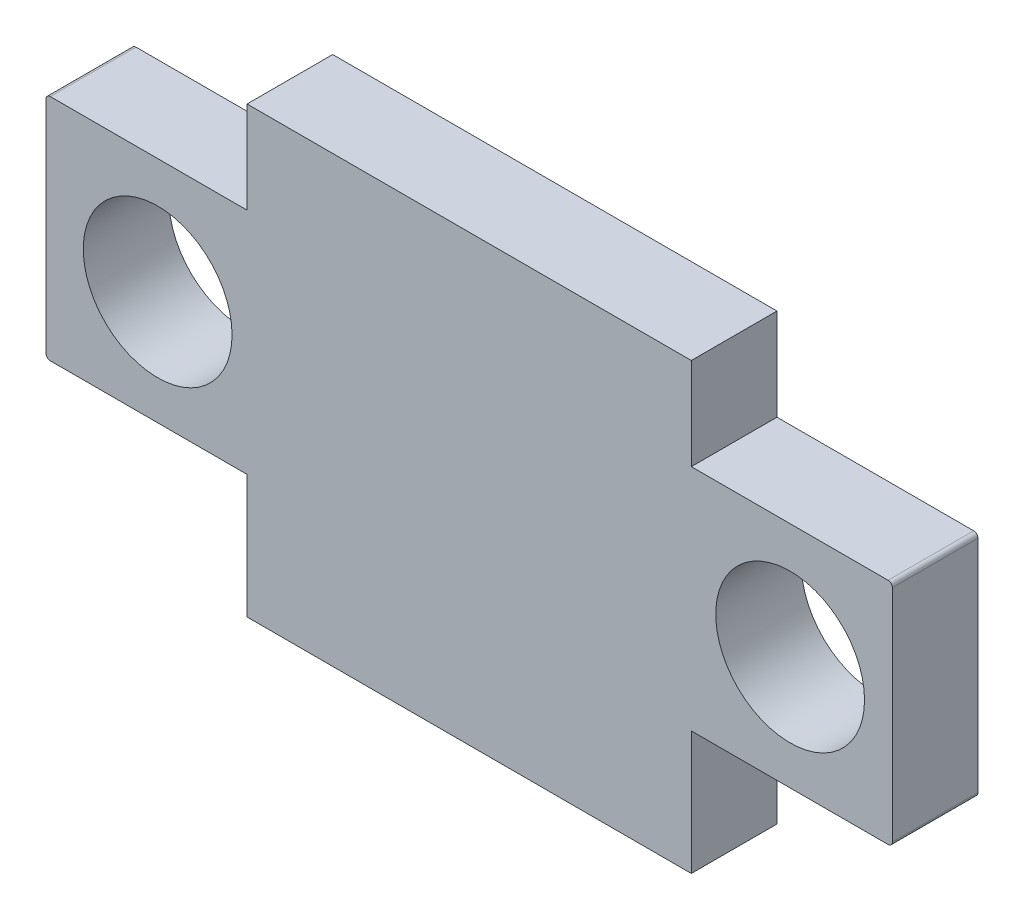
ISO-10303-21;
HEADER;
FILE_DESCRIPTION(('STEP AP214'),'2;1');
FILE_NAME('part.step','',(''),(''),'','','');
FILE_SCHEMA(('AUTOMOTIVE_DESIGN { 1 0 10303 214 1 1 1 1 }'));
ENDSEC;
DATA;
#1=APPLICATION_CONTEXT('core data for automotive mechanical design processes');
#2=APPLICATION_PROTOCOL_DEFINITION('international standard','automotive_design',2000,#1);
#3=PRODUCT_CONTEXT('',#1,'mechanical');
#4=PRODUCT('Part','Part','',(#3));
#5=PRODUCT_RELATED_PRODUCT_CATEGORY('part','',(#4));
#6=PRODUCT_DEFINITION_FORMATION('','',#4);
#7=PRODUCT_DEFINITION_CONTEXT('part definition',#1,'design');
#8=PRODUCT_DEFINITION('design','',#6,#7);
#9=PRODUCT_DEFINITION_SHAPE('','',#8);
#10=(LENGTH_UNIT() NAMED_UNIT(*) SI_UNIT(.MILLI.,.METRE.));
#11=(NAMED_UNIT(*) PLANE_ANGLE_UNIT() SI_UNIT($,.RADIAN.));
#12=(NAMED_UNIT(*) SI_UNIT($,.STERADIAN.) SOLID_ANGLE_UNIT());
#13=UNCERTAINTY_MEASURE_WITH_UNIT(LENGTH_MEASURE(1.E-05),#10,'distance_accuracy_value','');
#14=(GEOMETRIC_REPRESENTATION_CONTEXT(3) GLOBAL_UNCERTAINTY_ASSIGNED_CONTEXT((#13)) GLOBAL_UNIT_ASSIGNED_CONTEXT((#10,
#11,#12)) REPRESENTATION_CONTEXT('',''));
#15=CARTESIAN_POINT('',(0.,0.,0.));
#16=DIRECTION('',(0.,0.,1.));
#17=DIRECTION('',(1.,0.,0.));
#18=AXIS2_PLACEMENT_3D('',#15,#16,#17);
#19=CARTESIAN_POINT('',(0.,6.08054906162739,4.));
#20=DIRECTION('',(0.,-1.,0.));
#21=DIRECTION('',(0.,0.,-1.));
#22=AXIS2_PLACEMENT_3D('',#19,#20,#21);
#23=PLANE('',#22);
#24=DIRECTION('',(-1.,0.,0.));
#25=VECTOR('',#24,1.);
#26=CARTESIAN_POINT('',(0.,6.08054906162739,0.));
#27=LINE('',#26,#25);
#28=CARTESIAN_POINT('',(-10.375,6.08054906162739,0.));
#29=VERTEX_POINT('',#28);
#30=CARTESIAN_POINT('',(-19.5641972833082,6.08054906162739,0.));
#31=VERTEX_POINT('',#30);
#32=EDGE_CURVE('E205',#29,#31,#27,.T.);
#33=ORIENTED_EDGE('',*,*,#32,.T.);
#34=DIRECTION('',(0.,0.,-1.));
#35=VECTOR('',#34,1.);
#36=CARTESIAN_POINT('',(-19.5641972833082,6.08054906162739,4.));
#37=LINE('',#36,#35);
#38=CARTESIAN_POINT('',(-19.5641972833082,6.08054906162739,4.));
#39=VERTEX_POINT('',#38);
#40=EDGE_CURVE('E11',#39,#31,#37,.T.);
#41=ORIENTED_EDGE('',*,*,#40,.F.);
#42=DIRECTION('',(-1.,0.,0.));
#43=VECTOR('',#42,1.);
#44=CARTESIAN_POINT('',(0.,6.08054906162739,4.));
#45=LINE('',#44,#43);
#46=CARTESIAN_POINT('',(-10.375,6.08054906162739,4.));
#47=VERTEX_POINT('',#46);
#48=EDGE_CURVE('E359',#47,#39,#45,.T.);
#49=ORIENTED_EDGE('',*,*,#48,.F.);
#50=DIRECTION('',(0.,0.,-1.));
#51=VECTOR('',#50,1.);
#52=CARTESIAN_POINT('',(-10.375,6.08054906162739,4.));
#53=LINE('',#52,#51);
#54=EDGE_CURVE('E61',#47,#29,#53,.T.);
#55=ORIENTED_EDGE('',*,*,#54,.T.);
#56=EDGE_LOOP('',(#33,#41,#49,#55));
#57=FACE_BOUND('',#56,.T.);
#58=ADVANCED_FACE('F43',(#57),#23,.F.);
#59=CARTESIAN_POINT('',(-19.5641972833082,5.88054906162739,4.));
#60=DIRECTION('',(0.,0.,-1.));
#61=DIRECTION('',(-1.,0.,0.));
#62=AXIS2_PLACEMENT_3D('',#59,#60,#61);
#63=CYLINDRICAL_SURFACE('',#62,0.2);
#64=CARTESIAN_POINT('',(-19.5641972833082,5.88054906162739,0.));
#65=DIRECTION('',(0.,0.,1.));
#66=DIRECTION('',(1.,0.,0.));
#67=AXIS2_PLACEMENT_3D('',#64,#65,#66);
#68=CIRCLE('',#67,0.2);
#69=CARTESIAN_POINT('',(-19.7641972833082,5.88054906162739,0.));
#70=VERTEX_POINT('',#69);
#71=EDGE_CURVE('E208',#31,#70,#68,.T.);
#72=ORIENTED_EDGE('',*,*,#71,.T.);
#73=DIRECTION('',(0.,0.,-1.));
#74=VECTOR('',#73,1.);
#75=CARTESIAN_POINT('',(-19.7641972833082,5.88054906162739,4.));
#76=LINE('',#75,#74);
#77=CARTESIAN_POINT('',(-19.7641972833082,5.88054906162739,4.));
#78=VERTEX_POINT('',#77);
#79=EDGE_CURVE('E53',#78,#70,#76,.T.);
#80=ORIENTED_EDGE('',*,*,#79,.F.);
#81=CARTESIAN_POINT('',(-19.5641972833082,5.88054906162739,4.));
#82=DIRECTION('',(0.,0.,1.));
#83=DIRECTION('',(1.,0.,0.));
#84=AXIS2_PLACEMENT_3D('',#81,#82,#83);
#85=CIRCLE('',#84,0.2);
#86=EDGE_CURVE('E123',#39,#78,#85,.T.);
#87=ORIENTED_EDGE('',*,*,#86,.F.);
#88=ORIENTED_EDGE('',*,*,#40,.T.);
#89=EDGE_LOOP('',(#72,#80,#87,#88));
#90=FACE_BOUND('',#89,.T.);
#91=ADVANCED_FACE('F364',(#90),#63,.T.);
#92=CARTESIAN_POINT('',(-19.7641972833082,0.,4.));
#93=DIRECTION('',(1.,0.,0.));
#94=DIRECTION('',(0.,0.,-1.));
#95=AXIS2_PLACEMENT_3D('',#92,#93,#94);
#96=PLANE('',#95);
#97=DIRECTION('',(0.,-1.,0.));
#98=VECTOR('',#97,1.);
#99=CARTESIAN_POINT('',(-19.7641972833082,0.,0.));
#100=LINE('',#99,#98);
#101=CARTESIAN_POINT('',(-19.7641972833082,-4.40841613091758,0.));
#102=VERTEX_POINT('',#101);
#103=EDGE_CURVE('E211',#70,#102,#100,.T.);
#104=ORIENTED_EDGE('',*,*,#103,.T.);
#105=DIRECTION('',(0.,0.,-1.));
#106=VECTOR('',#105,1.);
#107=CARTESIAN_POINT('',(-19.7641972833082,-4.40841613091758,4.));
#108=LINE('',#107,#106);
#109=CARTESIAN_POINT('',(-19.7641972833082,-4.40841613091758,4.));
#110=VERTEX_POINT('',#109);
#111=EDGE_CURVE('E296',#110,#102,#108,.T.);
#112=ORIENTED_EDGE('',*,*,#111,.F.);
#113=DIRECTION('',(0.,-1.,0.));
#114=VECTOR('',#113,1.);
#115=CARTESIAN_POINT('',(-19.7641972833082,0.,4.));
#116=LINE('',#115,#114);
#117=EDGE_CURVE('E306',#78,#110,#116,.T.);
#118=ORIENTED_EDGE('',*,*,#117,.F.);
#119=ORIENTED_EDGE('',*,*,#79,.T.);
#120=EDGE_LOOP('',(#104,#112,#118,#119));
#121=FACE_BOUND('',#120,.T.);
#122=ADVANCED_FACE('F304',(#121),#96,.F.);
#123=CARTESIAN_POINT('',(-19.5641972833082,-4.40841613091758,4.));
#124=DIRECTION('',(0.,0.,-1.));
#125=DIRECTION('',(-1.,0.,0.));
#126=AXIS2_PLACEMENT_3D('',#123,#124,#125);
#127=CYLINDRICAL_SURFACE('',#126,0.199999999999999);
#128=CARTESIAN_POINT('',(-19.5641972833082,-4.40841613091758,0.));
#129=DIRECTION('',(0.,0.,1.));
#130=DIRECTION('',(1.,0.,0.));
#131=AXIS2_PLACEMENT_3D('',#128,#129,#130);
#132=CIRCLE('',#131,0.199999999999999);
#133=CARTESIAN_POINT('',(-19.5641972833082,-4.60841613091758,0.));
#134=VERTEX_POINT('',#133);
#135=EDGE_CURVE('E214',#102,#134,#132,.T.);
#136=ORIENTED_EDGE('',*,*,#135,.T.);
#137=DIRECTION('',(0.,0.,-1.));
#138=VECTOR('',#137,1.);
#139=CARTESIAN_POINT('',(-19.5641972833082,-4.60841613091758,4.));
#140=LINE('',#139,#138);
#141=CARTESIAN_POINT('',(-19.5641972833082,-4.60841613091758,4.));
#142=VERTEX_POINT('',#141);
#143=EDGE_CURVE('E293',#142,#134,#140,.T.);
#144=ORIENTED_EDGE('',*,*,#143,.F.);
#145=CARTESIAN_POINT('',(-19.5641972833082,-4.40841613091758,4.));
#146=DIRECTION('',(0.,0.,1.));
#147=DIRECTION('',(1.,0.,0.));
#148=AXIS2_PLACEMENT_3D('',#145,#146,#147);
#149=CIRCLE('',#148,0.199999999999999);
#150=EDGE_CURVE('E317',#110,#142,#149,.T.);
#151=ORIENTED_EDGE('',*,*,#150,.F.);
#152=ORIENTED_EDGE('',*,*,#111,.T.);
#153=EDGE_LOOP('',(#136,#144,#151,#152));
#154=FACE_BOUND('',#153,.T.);
#155=ADVANCED_FACE('F314',(#154),#127,.T.);
#156=CARTESIAN_POINT('',(0.,-4.60841613091758,4.));
#157=DIRECTION('',(0.,-1.,0.));
#158=DIRECTION('',(1.,0.,0.));
#159=AXIS2_PLACEMENT_3D('',#156,#157,#158);
#160=PLANE('',#159);
#161=DIRECTION('',(-1.,0.,0.));
#162=VECTOR('',#161,1.);
#163=CARTESIAN_POINT('',(0.,-4.60841613091758,0.));
#164=LINE('',#163,#162);
#165=CARTESIAN_POINT('',(-10.375,-4.60841613091758,0.));
#166=VERTEX_POINT('',#165);
#167=EDGE_CURVE('E218',#166,#134,#164,.T.);
#168=ORIENTED_EDGE('',*,*,#167,.F.);
#169=DIRECTION('',(0.,0.,-1.));
#170=VECTOR('',#169,1.);
#171=CARTESIAN_POINT('',(-10.375,-4.60841613091758,4.));
#172=LINE('',#171,#170);
#173=CARTESIAN_POINT('',(-10.375,-4.60841613091758,4.));
#174=VERTEX_POINT('',#173);
#175=EDGE_CURVE('E290',#174,#166,#172,.T.);
#176=ORIENTED_EDGE('',*,*,#175,.F.);
#177=DIRECTION('',(-1.,0.,0.));
#178=VECTOR('',#177,1.);
#179=CARTESIAN_POINT('',(0.,-4.60841613091758,4.));
#180=LINE('',#179,#178);
#181=EDGE_CURVE('E320',#174,#142,#180,.T.);
#182=ORIENTED_EDGE('',*,*,#181,.T.);
#183=ORIENTED_EDGE('',*,*,#143,.T.);
#184=EDGE_LOOP('',(#168,#176,#182,#183));
#185=FACE_BOUND('',#184,.T.);
#186=ADVANCED_FACE('F375',(#185),#160,.T.);
#187=CARTESIAN_POINT('',(-10.375,0.,4.));
#188=DIRECTION('',(-1.,0.,0.));
#189=DIRECTION('',(0.,0.,1.));
#190=AXIS2_PLACEMENT_3D('',#187,#188,#189);
#191=PLANE('',#190);
#192=DIRECTION('',(0.,1.,0.));
#193=VECTOR('',#192,1.);
#194=CARTESIAN_POINT('',(-10.375,0.,0.));
#195=LINE('',#194,#193);
#196=CARTESIAN_POINT('',(-10.375,-10.375,0.));
#197=VERTEX_POINT('',#196);
#198=EDGE_CURVE('E222',#197,#166,#195,.T.);
#199=ORIENTED_EDGE('',*,*,#198,.F.);
#200=DIRECTION('',(0.,0.,-1.));
#201=VECTOR('',#200,1.);
#202=CARTESIAN_POINT('',(-10.375,-10.375,4.));
#203=LINE('',#202,#201);
#204=CARTESIAN_POINT('',(-10.375,-10.375,4.));
#205=VERTEX_POINT('',#204);
#206=EDGE_CURVE('E287',#205,#197,#203,.T.);
#207=ORIENTED_EDGE('',*,*,#206,.F.);
#208=DIRECTION('',(0.,1.,0.));
#209=VECTOR('',#208,1.);
#210=CARTESIAN_POINT('',(-10.375,0.,4.));
#211=LINE('',#210,#209);
#212=EDGE_CURVE('E194',#205,#174,#211,.T.);
#213=ORIENTED_EDGE('',*,*,#212,.T.);
#214=ORIENTED_EDGE('',*,*,#175,.T.);
#215=EDGE_LOOP('',(#199,#207,#213,#214));
#216=FACE_BOUND('',#215,.T.);
#217=ADVANCED_FACE('F378',(#216),#191,.T.);
#218=CARTESIAN_POINT('',(0.,-10.375,4.));
#219=DIRECTION('',(0.,1.,0.));
#220=DIRECTION('',(0.,0.,1.));
#221=AXIS2_PLACEMENT_3D('',#218,#219,#220);
#222=PLANE('',#221);
#223=DIRECTION('',(1.,0.,0.));
#224=VECTOR('',#223,1.);
#225=CARTESIAN_POINT('',(0.,-10.375,0.));
#226=LINE('',#225,#224);
#227=CARTESIAN_POINT('',(10.375,-10.375,0.));
#228=VERTEX_POINT('',#227);
#229=EDGE_CURVE('E226',#197,#228,#226,.T.);
#230=ORIENTED_EDGE('',*,*,#229,.T.);
#231=DIRECTION('',(0.,0.,-1.));
#232=VECTOR('',#231,1.);
#233=CARTESIAN_POINT('',(10.375,-10.375,4.));
#234=LINE('',#233,#232);
#235=CARTESIAN_POINT('',(10.375,-10.375,4.));
#236=VERTEX_POINT('',#235);
#237=EDGE_CURVE('E283',#236,#228,#234,.T.);
#238=ORIENTED_EDGE('',*,*,#237,.F.);
#239=DIRECTION('',(1.,0.,0.));
#240=VECTOR('',#239,1.);
#241=CARTESIAN_POINT('',(0.,-10.375,4.));
#242=LINE('',#241,#240);
#243=EDGE_CURVE('E330',#205,#236,#242,.T.);
#244=ORIENTED_EDGE('',*,*,#243,.F.);
#245=ORIENTED_EDGE('',*,*,#206,.T.);
#246=EDGE_LOOP('',(#230,#238,#244,#245));
#247=FACE_BOUND('',#246,.T.);
#248=ADVANCED_FACE('F380',(#247),#222,.F.);
#249=CARTESIAN_POINT('',(10.375,0.,4.));
#250=DIRECTION('',(-1.,0.,0.));
#251=DIRECTION('',(0.,0.,1.));
#252=AXIS2_PLACEMENT_3D('',#249,#250,#251);
#253=PLANE('',#252);
#254=DIRECTION('',(0.,1.,0.));
#255=VECTOR('',#254,1.);
#256=CARTESIAN_POINT('',(10.375,0.,0.));
#257=LINE('',#256,#255);
#258=CARTESIAN_POINT('',(10.375,-4.60841613091758,0.));
#259=VERTEX_POINT('',#258);
#260=EDGE_CURVE('E230',#228,#259,#257,.T.);
#261=ORIENTED_EDGE('',*,*,#260,.T.);
#262=DIRECTION('',(0.,0.,-1.));
#263=VECTOR('',#262,1.);
#264=CARTESIAN_POINT('',(10.375,-4.60841613091758,4.));
#265=LINE('',#264,#263);
#266=CARTESIAN_POINT('',(10.375,-4.60841613091758,4.));
#267=VERTEX_POINT('',#266);
#268=EDGE_CURVE('E279',#267,#259,#265,.T.);
#269=ORIENTED_EDGE('',*,*,#268,.F.);
#270=DIRECTION('',(0.,1.,0.));
#271=VECTOR('',#270,1.);
#272=CARTESIAN_POINT('',(10.375,0.,4.));
#273=LINE('',#272,#271);
#274=EDGE_CURVE('E176',#236,#267,#273,.T.);
#275=ORIENTED_EDGE('',*,*,#274,.F.);
#276=ORIENTED_EDGE('',*,*,#237,.T.);
#277=EDGE_LOOP('',(#261,#269,#275,#276));
#278=FACE_BOUND('',#277,.T.);
#279=ADVANCED_FACE('F383',(#278),#253,.F.);
#280=CARTESIAN_POINT('',(0.,-4.60841613091758,4.));
#281=DIRECTION('',(0.,1.,0.));
#282=DIRECTION('',(-1.,0.,0.));
#283=AXIS2_PLACEMENT_3D('',#280,#281,#282);
#284=PLANE('',#283);
#285=DIRECTION('',(1.,0.,0.));
#286=VECTOR('',#285,1.);
#287=CARTESIAN_POINT('',(0.,-4.60841613091758,0.));
#288=LINE('',#287,#286);
#289=CARTESIAN_POINT('',(19.5641972833082,-4.60841613091758,0.));
#290=VERTEX_POINT('',#289);
#291=EDGE_CURVE('E233',#259,#290,#288,.T.);
#292=ORIENTED_EDGE('',*,*,#291,.T.);
#293=DIRECTION('',(0.,0.,-1.));
#294=VECTOR('',#293,1.);
#295=CARTESIAN_POINT('',(19.5641972833082,-4.60841613091758,4.));
#296=LINE('',#295,#294);
#297=CARTESIAN_POINT('',(19.5641972833082,-4.60841613091758,4.));
#298=VERTEX_POINT('',#297);
#299=EDGE_CURVE('E275',#298,#290,#296,.T.);
#300=ORIENTED_EDGE('',*,*,#299,.F.);
#301=DIRECTION('',(1.,0.,0.));
#302=VECTOR('',#301,1.);
#303=CARTESIAN_POINT('',(0.,-4.60841613091758,4.));
#304=LINE('',#303,#302);
#305=EDGE_CURVE('E334',#267,#298,#304,.T.);
#306=ORIENTED_EDGE('',*,*,#305,.F.);
#307=ORIENTED_EDGE('',*,*,#268,.T.);
#308=EDGE_LOOP('',(#292,#300,#306,#307));
#309=FACE_BOUND('',#308,.T.);
#310=ADVANCED_FACE('F385',(#309),#284,.F.);
#311=CARTESIAN_POINT('',(19.5641972833082,-4.40841613091758,4.));
#312=DIRECTION('',(0.,0.,-1.));
#313=DIRECTION('',(-1.,0.,0.));
#314=AXIS2_PLACEMENT_3D('',#311,#312,#313);
#315=CYLINDRICAL_SURFACE('',#314,0.200000000000001);
#316=CARTESIAN_POINT('',(19.5641972833082,-4.40841613091758,0.));
#317=DIRECTION('',(0.,0.,1.));
#318=DIRECTION('',(1.,0.,0.));
#319=AXIS2_PLACEMENT_3D('',#316,#317,#318);
#320=CIRCLE('',#319,0.200000000000001);
#321=CARTESIAN_POINT('',(19.7641972833083,-4.40841613091758,0.));
#322=VERTEX_POINT('',#321);
#323=EDGE_CURVE('E236',#290,#322,#320,.T.);
#324=ORIENTED_EDGE('',*,*,#323,.T.);
#325=DIRECTION('',(0.,0.,-1.));
#326=VECTOR('',#325,1.);
#327=CARTESIAN_POINT('',(19.7641972833083,-4.40841613091758,4.));
#328=LINE('',#327,#326);
#329=CARTESIAN_POINT('',(19.7641972833083,-4.40841613091758,4.));
#330=VERTEX_POINT('',#329);
#331=EDGE_CURVE('E272',#330,#322,#328,.T.);
#332=ORIENTED_EDGE('',*,*,#331,.F.);
#333=CARTESIAN_POINT('',(19.5641972833082,-4.40841613091758,4.));
#334=DIRECTION('',(0.,0.,1.));
#335=DIRECTION('',(1.,0.,0.));
#336=AXIS2_PLACEMENT_3D('',#333,#334,#335);
#337=CIRCLE('',#336,0.200000000000001);
#338=EDGE_CURVE('E337',#298,#330,#337,.T.);
#339=ORIENTED_EDGE('',*,*,#338,.F.);
#340=ORIENTED_EDGE('',*,*,#299,.T.);
#341=EDGE_LOOP('',(#324,#332,#339,#340));
#342=FACE_BOUND('',#341,.T.);
#343=ADVANCED_FACE('F388',(#342),#315,.T.);
#344=CARTESIAN_POINT('',(19.7641972833083,0.,4.));
#345=DIRECTION('',(1.,0.,0.));
#346=DIRECTION('',(0.,0.,-1.));
#347=AXIS2_PLACEMENT_3D('',#344,#345,#346);
#348=PLANE('',#347);
#349=DIRECTION('',(0.,-1.,0.));
#350=VECTOR('',#349,1.);
#351=CARTESIAN_POINT('',(19.7641972833083,0.,0.));
#352=LINE('',#351,#350);
#353=CARTESIAN_POINT('',(19.7641972833083,5.88054906162739,0.));
#354=VERTEX_POINT('',#353);
#355=EDGE_CURVE('E240',#354,#322,#352,.T.);
#356=ORIENTED_EDGE('',*,*,#355,.F.);
#357=DIRECTION('',(0.,0.,-1.));
#358=VECTOR('',#357,1.);
#359=CARTESIAN_POINT('',(19.7641972833083,5.88054906162739,4.));
#360=LINE('',#359,#358);
#361=CARTESIAN_POINT('',(19.7641972833083,5.88054906162739,4.));
#362=VERTEX_POINT('',#361);
#363=EDGE_CURVE('E269',#362,#354,#360,.T.);
#364=ORIENTED_EDGE('',*,*,#363,.F.);
#365=DIRECTION('',(0.,-1.,0.));
#366=VECTOR('',#365,1.);
#367=CARTESIAN_POINT('',(19.7641972833083,0.,4.));
#368=LINE('',#367,#366);
#369=EDGE_CURVE('E340',#362,#330,#368,.T.);
#370=ORIENTED_EDGE('',*,*,#369,.T.);
#371=ORIENTED_EDGE('',*,*,#331,.T.);
#372=EDGE_LOOP('',(#356,#364,#370,#371));
#373=FACE_BOUND('',#372,.T.);
#374=ADVANCED_FACE('F392',(#373),#348,.T.);
#375=CARTESIAN_POINT('',(19.5641972833082,5.88054906162739,4.));
#376=DIRECTION('',(0.,0.,-1.));
#377=DIRECTION('',(-1.,0.,0.));
#378=AXIS2_PLACEMENT_3D('',#375,#376,#377);
#379=CYLINDRICAL_SURFACE('',#378,0.200000000000001);
#380=CARTESIAN_POINT('',(19.5641972833082,5.88054906162739,0.));
#381=DIRECTION('',(0.,0.,1.));
#382=DIRECTION('',(1.,0.,0.));
#383=AXIS2_PLACEMENT_3D('',#380,#381,#382);
#384=CIRCLE('',#383,0.200000000000001);
#385=CARTESIAN_POINT('',(19.5641972833082,6.08054906162739,0.));
#386=VERTEX_POINT('',#385);
#387=EDGE_CURVE('E244',#354,#386,#384,.T.);
#388=ORIENTED_EDGE('',*,*,#387,.T.);
#389=DIRECTION('',(0.,0.,-1.));
#390=VECTOR('',#389,1.);
#391=CARTESIAN_POINT('',(19.5641972833082,6.08054906162739,4.));
#392=LINE('',#391,#390);
#393=CARTESIAN_POINT('',(19.5641972833082,6.08054906162739,4.));
#394=VERTEX_POINT('',#393);
#395=EDGE_CURVE('E266',#394,#386,#392,.T.);
#396=ORIENTED_EDGE('',*,*,#395,.F.);
#397=CARTESIAN_POINT('',(19.5641972833082,5.88054906162739,4.));
#398=DIRECTION('',(0.,0.,1.));
#399=DIRECTION('',(1.,0.,0.));
#400=AXIS2_PLACEMENT_3D('',#397,#398,#399);
#401=CIRCLE('',#400,0.200000000000001);
#402=EDGE_CURVE('E343',#362,#394,#401,.T.);
#403=ORIENTED_EDGE('',*,*,#402,.F.);
#404=ORIENTED_EDGE('',*,*,#363,.T.);
#405=EDGE_LOOP('',(#388,#396,#403,#404));
#406=FACE_BOUND('',#405,.T.);
#407=ADVANCED_FACE('F396',(#406),#379,.T.);
#408=CARTESIAN_POINT('',(0.,6.08054906162739,4.));
#409=DIRECTION('',(0.,1.,0.));
#410=DIRECTION('',(-1.,0.,0.));
#411=AXIS2_PLACEMENT_3D('',#408,#409,#410);
#412=PLANE('',#411);
#413=DIRECTION('',(1.,0.,0.));
#414=VECTOR('',#413,1.);
#415=CARTESIAN_POINT('',(0.,6.08054906162739,0.));
#416=LINE('',#415,#414);
#417=CARTESIAN_POINT('',(10.375,6.08054906162739,0.));
#418=VERTEX_POINT('',#417);
#419=EDGE_CURVE('E248',#418,#386,#416,.T.);
#420=ORIENTED_EDGE('',*,*,#419,.F.);
#421=DIRECTION('',(0.,0.,-1.));
#422=VECTOR('',#421,1.);
#423=CARTESIAN_POINT('',(10.375,6.08054906162739,4.));
#424=LINE('',#423,#422);
#425=CARTESIAN_POINT('',(10.375,6.08054906162739,4.));
#426=VERTEX_POINT('',#425);
#427=EDGE_CURVE('E185',#426,#418,#424,.T.);
#428=ORIENTED_EDGE('',*,*,#427,.F.);
#429=DIRECTION('',(1.,0.,0.));
#430=VECTOR('',#429,1.);
#431=CARTESIAN_POINT('',(0.,6.08054906162739,4.));
#432=LINE('',#431,#430);
#433=EDGE_CURVE('E172',#426,#394,#432,.T.);
#434=ORIENTED_EDGE('',*,*,#433,.T.);
#435=ORIENTED_EDGE('',*,*,#395,.T.);
#436=EDGE_LOOP('',(#420,#428,#434,#435));
#437=FACE_BOUND('',#436,.T.);
#438=ADVANCED_FACE('F351',(#437),#412,.T.);
#439=CARTESIAN_POINT('',(10.375,10.375,0.));
#440=VERTEX_POINT('',#439);
#441=EDGE_CURVE('E181',#418,#440,#257,.T.);
#442=ORIENTED_EDGE('',*,*,#441,.T.);
#443=DIRECTION('',(0.,0.,-1.));
#444=VECTOR('',#443,1.);
#445=CARTESIAN_POINT('',(10.375,10.375,4.));
#446=LINE('',#445,#444);
#447=CARTESIAN_POINT('',(10.375,10.375,4.));
#448=VERTEX_POINT('',#447);
#449=EDGE_CURVE('E178',#448,#440,#446,.T.);
#450=ORIENTED_EDGE('',*,*,#449,.F.);
#451=EDGE_CURVE('E164',#426,#448,#273,.T.);
#452=ORIENTED_EDGE('',*,*,#451,.F.);
#453=ORIENTED_EDGE('',*,*,#427,.T.);
#454=EDGE_LOOP('',(#442,#450,#452,#453));
#455=FACE_BOUND('',#454,.T.);
#456=ADVANCED_FACE('F179',(#455),#253,.F.);
#457=CARTESIAN_POINT('',(0.,10.375,4.));
#458=DIRECTION('',(0.,1.,0.));
#459=DIRECTION('',(0.,0.,1.));
#460=AXIS2_PLACEMENT_3D('',#457,#458,#459);
#461=PLANE('',#460);
#462=DIRECTION('',(1.,0.,0.));
#463=VECTOR('',#462,1.);
#464=CARTESIAN_POINT('',(0.,10.375,0.));
#465=LINE('',#464,#463);
#466=CARTESIAN_POINT('',(-10.375,10.375,0.));
#467=VERTEX_POINT('',#466);
#468=EDGE_CURVE('E252',#467,#440,#465,.T.);
#469=ORIENTED_EDGE('',*,*,#468,.F.);
#470=DIRECTION('',(0.,0.,-1.));
#471=VECTOR('',#470,1.);
#472=CARTESIAN_POINT('',(-10.375,10.375,4.));
#473=LINE('',#472,#471);
#474=CARTESIAN_POINT('',(-10.375,10.375,4.));
#475=VERTEX_POINT('',#474);
#476=EDGE_CURVE('E111',#475,#467,#473,.T.);
#477=ORIENTED_EDGE('',*,*,#476,.F.);
#478=DIRECTION('',(1.,0.,0.));
#479=VECTOR('',#478,1.);
#480=CARTESIAN_POINT('',(0.,10.375,4.));
#481=LINE('',#480,#479);
#482=EDGE_CURVE('E170',#475,#448,#481,.T.);
#483=ORIENTED_EDGE('',*,*,#482,.T.);
#484=ORIENTED_EDGE('',*,*,#449,.T.);
#485=EDGE_LOOP('',(#469,#477,#483,#484));
#486=FACE_BOUND('',#485,.T.);
#487=ADVANCED_FACE('F187',(#486),#461,.T.);
#488=EDGE_CURVE('E227',#29,#467,#195,.T.);
#489=ORIENTED_EDGE('',*,*,#488,.F.);
#490=ORIENTED_EDGE('',*,*,#54,.F.);
#491=EDGE_CURVE('E189',#47,#475,#211,.T.);
#492=ORIENTED_EDGE('',*,*,#491,.T.);
#493=ORIENTED_EDGE('',*,*,#476,.T.);
#494=EDGE_LOOP('',(#489,#490,#492,#493));
#495=FACE_BOUND('',#494,.T.);
#496=ADVANCED_FACE('F407',(#495),#191,.T.);
#497=CARTESIAN_POINT('',(-14.5492237444466,0.688062130657844,4.));
#498=DIRECTION('',(0.,0.,-1.));
#499=DIRECTION('',(-1.,0.,0.));
#500=AXIS2_PLACEMENT_3D('',#497,#498,#499);
#501=CYLINDRICAL_SURFACE('',#500,3.475);
#502=CARTESIAN_POINT('',(-14.5492237444466,0.688062130657844,4.));
#503=DIRECTION('',(0.,0.,1.));
#504=DIRECTION('',(1.,0.,0.));
#505=AXIS2_PLACEMENT_3D('',#502,#503,#504);
#506=CIRCLE('',#505,3.475);
#507=CARTESIAN_POINT('',(-11.0742237444466,0.688062130657844,4.));
#508=VERTEX_POINT('',#507);
#509=EDGE_CURVE('E259',#508,#508,#506,.T.);
#510=ORIENTED_EDGE('',*,*,#509,.T.);
#511=EDGE_LOOP('',(#510));
#512=FACE_BOUND('',#511,.T.);
#513=CARTESIAN_POINT('',(-14.5492237444466,0.688062130657844,0.));
#514=DIRECTION('',(0.,0.,1.));
#515=DIRECTION('',(1.,0.,0.));
#516=AXIS2_PLACEMENT_3D('',#513,#514,#515);
#517=CIRCLE('',#516,3.475);
#518=CARTESIAN_POINT('',(-11.0742237444466,0.688062130657844,0.));
#519=VERTEX_POINT('',#518);
#520=EDGE_CURVE('E201',#519,#519,#517,.T.);
#521=ORIENTED_EDGE('',*,*,#520,.F.);
#522=EDGE_LOOP('',(#521));
#523=FACE_BOUND('',#522,.T.);
#524=ADVANCED_FACE('F45',(#512,#523),#501,.F.);
#525=CARTESIAN_POINT('',(14.9894435391432,0.688062130657389,4.));
#526=DIRECTION('',(0.,0.,-1.));
#527=DIRECTION('',(-1.,0.,0.));
#528=AXIS2_PLACEMENT_3D('',#525,#526,#527);
#529=CYLINDRICAL_SURFACE('',#528,3.475);
#530=CARTESIAN_POINT('',(14.9894435391432,0.688062130657389,4.));
#531=DIRECTION('',(0.,0.,1.));
#532=DIRECTION('',(1.,0.,0.));
#533=AXIS2_PLACEMENT_3D('',#530,#531,#532);
#534=CIRCLE('',#533,3.475);
#535=CARTESIAN_POINT('',(18.4644435391432,0.688062130657389,4.));
#536=VERTEX_POINT('',#535);
#537=EDGE_CURVE('E192',#536,#536,#534,.T.);
#538=ORIENTED_EDGE('',*,*,#537,.T.);
#539=EDGE_LOOP('',(#538));
#540=FACE_BOUND('',#539,.T.);
#541=CARTESIAN_POINT('',(14.9894435391432,0.688062130657389,0.));
#542=DIRECTION('',(0.,0.,1.));
#543=DIRECTION('',(1.,0.,0.));
#544=AXIS2_PLACEMENT_3D('',#541,#542,#543);
#545=CIRCLE('',#544,3.475);
#546=CARTESIAN_POINT('',(18.4644435391432,0.688062130657389,0.));
#547=VERTEX_POINT('',#546);
#548=EDGE_CURVE('E255',#547,#547,#545,.T.);
#549=ORIENTED_EDGE('',*,*,#548,.F.);
#550=EDGE_LOOP('',(#549));
#551=FACE_BOUND('',#550,.T.);
#552=ADVANCED_FACE('F410',(#540,#551),#529,.F.);
#553=CARTESIAN_POINT('',(0.,0.,4.));
#554=DIRECTION('',(0.,0.,1.));
#555=DIRECTION('',(1.,0.,0.));
#556=AXIS2_PLACEMENT_3D('',#553,#554,#555);
#557=PLANE('',#556);
#558=ORIENTED_EDGE('',*,*,#509,.F.);
#559=EDGE_LOOP('',(#558));
#560=FACE_BOUND('',#559,.T.);
#561=ORIENTED_EDGE('',*,*,#48,.T.);
#562=ORIENTED_EDGE('',*,*,#86,.T.);
#563=ORIENTED_EDGE('',*,*,#117,.T.);
#564=ORIENTED_EDGE('',*,*,#150,.T.);
#565=ORIENTED_EDGE('',*,*,#181,.F.);
#566=ORIENTED_EDGE('',*,*,#212,.F.);
#567=ORIENTED_EDGE('',*,*,#243,.T.);
#568=ORIENTED_EDGE('',*,*,#274,.T.);
#569=ORIENTED_EDGE('',*,*,#305,.T.);
#570=ORIENTED_EDGE('',*,*,#338,.T.);
#571=ORIENTED_EDGE('',*,*,#369,.F.);
#572=ORIENTED_EDGE('',*,*,#402,.T.);
#573=ORIENTED_EDGE('',*,*,#433,.F.);
#574=ORIENTED_EDGE('',*,*,#451,.T.);
#575=ORIENTED_EDGE('',*,*,#482,.F.);
#576=ORIENTED_EDGE('',*,*,#491,.F.);
#577=EDGE_LOOP('',(#561,#562,#563,#564,#565,#566,#567,#568,#569,#570,#571,#572,#573,#574,#575,#576));
#578=FACE_BOUND('',#577,.T.);
#579=ORIENTED_EDGE('',*,*,#537,.F.);
#580=EDGE_LOOP('',(#579));
#581=FACE_BOUND('',#580,.T.);
#582=ADVANCED_FACE('F166',(#560,#578,#581),#557,.T.);
#583=CARTESIAN_POINT('',(0.,0.,0.));
#584=DIRECTION('',(0.,0.,1.));
#585=DIRECTION('',(1.,0.,0.));
#586=AXIS2_PLACEMENT_3D('',#583,#584,#585);
#587=PLANE('',#586);
#588=ORIENTED_EDGE('',*,*,#520,.T.);
#589=EDGE_LOOP('',(#588));
#590=FACE_BOUND('',#589,.T.);
#591=ORIENTED_EDGE('',*,*,#32,.F.);
#592=ORIENTED_EDGE('',*,*,#488,.T.);
#593=ORIENTED_EDGE('',*,*,#468,.T.);
#594=ORIENTED_EDGE('',*,*,#441,.F.);
#595=ORIENTED_EDGE('',*,*,#419,.T.);
#596=ORIENTED_EDGE('',*,*,#387,.F.);
#597=ORIENTED_EDGE('',*,*,#355,.T.);
#598=ORIENTED_EDGE('',*,*,#323,.F.);
#599=ORIENTED_EDGE('',*,*,#291,.F.);
#600=ORIENTED_EDGE('',*,*,#260,.F.);
#601=ORIENTED_EDGE('',*,*,#229,.F.);
#602=ORIENTED_EDGE('',*,*,#198,.T.);
#603=ORIENTED_EDGE('',*,*,#167,.T.);
#604=ORIENTED_EDGE('',*,*,#135,.F.);
#605=ORIENTED_EDGE('',*,*,#103,.F.);
#606=ORIENTED_EDGE('',*,*,#71,.F.);
#607=EDGE_LOOP('',(#591,#592,#593,#594,#595,#596,#597,#598,#599,#600,#601,#602,#603,#604,#605,#606));
#608=FACE_BOUND('',#607,.T.);
#609=ORIENTED_EDGE('',*,*,#548,.T.);
#610=EDGE_LOOP('',(#609));
#611=FACE_BOUND('',#610,.T.);
#612=ADVANCED_FACE('F309',(#590,#608,#611),#587,.F.);
#613=CLOSED_SHELL('',(#58,#91,#122,#155,#186,#217,#248,#279,#310,#343,#374,#407,#438,#456,#487,
#496,#524,#552,#582,#612));
#614=MANIFOLD_SOLID_BREP('B2',#613);
#615=ADVANCED_BREP_SHAPE_REPRESENTATION('',(#18,#614),#14);
#616=SHAPE_DEFINITION_REPRESENTATION(#9,#615);
ENDSEC;
END-ISO-10303-21;
